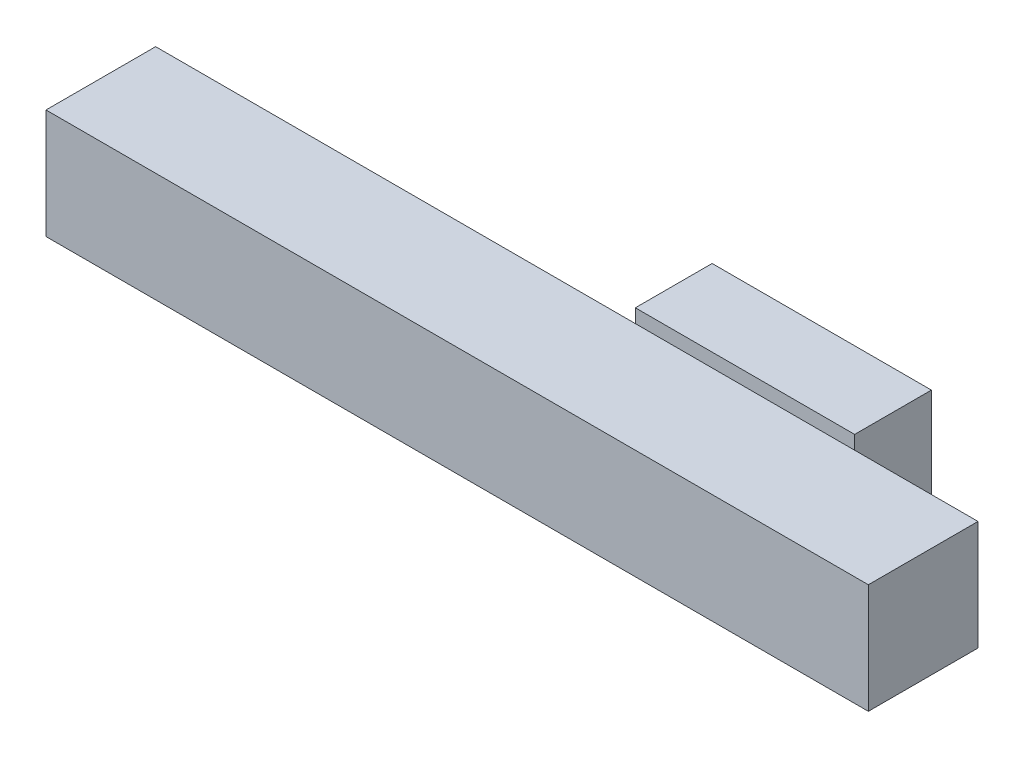
ISO-10303-21;
HEADER;
FILE_DESCRIPTION(('STEP AP214'),'2;1');
FILE_NAME('part.step','',(''),(''),'','','');
FILE_SCHEMA(('AUTOMOTIVE_DESIGN { 1 0 10303 214 1 1 1 1 }'));
ENDSEC;
DATA;
#1=APPLICATION_CONTEXT('core data for automotive mechanical design processes');
#2=APPLICATION_PROTOCOL_DEFINITION('international standard','automotive_design',2000,#1);
#3=PRODUCT_CONTEXT('',#1,'mechanical');
#4=PRODUCT('Part','Part','',(#3));
#5=PRODUCT_RELATED_PRODUCT_CATEGORY('part','',(#4));
#6=PRODUCT_DEFINITION_FORMATION('','',#4);
#7=PRODUCT_DEFINITION_CONTEXT('part definition',#1,'design');
#8=PRODUCT_DEFINITION('design','',#6,#7);
#9=PRODUCT_DEFINITION_SHAPE('','',#8);
#10=(LENGTH_UNIT() NAMED_UNIT(*) SI_UNIT(.MILLI.,.METRE.));
#11=(NAMED_UNIT(*) PLANE_ANGLE_UNIT() SI_UNIT($,.RADIAN.));
#12=(NAMED_UNIT(*) SI_UNIT($,.STERADIAN.) SOLID_ANGLE_UNIT());
#13=UNCERTAINTY_MEASURE_WITH_UNIT(LENGTH_MEASURE(1.E-05),#10,'distance_accuracy_value','');
#14=(GEOMETRIC_REPRESENTATION_CONTEXT(3) GLOBAL_UNCERTAINTY_ASSIGNED_CONTEXT((#13)) GLOBAL_UNIT_ASSIGNED_CONTEXT((#10,
#11,#12)) REPRESENTATION_CONTEXT('',''));
#15=CARTESIAN_POINT('',(0.,0.,0.));
#16=DIRECTION('',(0.,0.,1.));
#17=DIRECTION('',(1.,0.,0.));
#18=AXIS2_PLACEMENT_3D('',#15,#16,#17);
#19=CARTESIAN_POINT('',(0.,0.,28.));
#20=DIRECTION('',(0.,0.,-1.));
#21=DIRECTION('',(-1.,0.,0.));
#22=AXIS2_PLACEMENT_3D('',#19,#20,#21);
#23=PLANE('',#22);
#24=DIRECTION('',(1.,0.,0.));
#25=VECTOR('',#24,1.);
#26=CARTESIAN_POINT('',(-215.,-20.5,28.));
#27=LINE('',#26,#25);
#28=CARTESIAN_POINT('',(-40.,-20.5,28.));
#29=VERTEX_POINT('',#28);
#30=CARTESIAN_POINT('',(40.,-20.5,28.));
#31=VERTEX_POINT('',#30);
#32=EDGE_CURVE('E11',#29,#31,#27,.T.);
#33=ORIENTED_EDGE('',*,*,#32,.F.);
#34=DIRECTION('',(0.,-1.,0.));
#35=VECTOR('',#34,1.);
#36=CARTESIAN_POINT('',(-40.,-24.5,28.));
#37=LINE('',#36,#35);
#38=CARTESIAN_POINT('',(-40.,-24.5,28.));
#39=VERTEX_POINT('',#38);
#40=EDGE_CURVE('E156',#29,#39,#37,.T.);
#41=ORIENTED_EDGE('',*,*,#40,.T.);
#42=DIRECTION('',(1.,0.,0.));
#43=VECTOR('',#42,1.);
#44=CARTESIAN_POINT('',(-40.,-24.5,28.));
#45=LINE('',#44,#43);
#46=CARTESIAN_POINT('',(40.,-24.5,28.));
#47=VERTEX_POINT('',#46);
#48=EDGE_CURVE('E159',#39,#47,#45,.T.);
#49=ORIENTED_EDGE('',*,*,#48,.T.);
#50=DIRECTION('',(0.,1.,0.));
#51=VECTOR('',#50,1.);
#52=CARTESIAN_POINT('',(40.,-24.5,28.));
#53=LINE('',#52,#51);
#54=EDGE_CURVE('E150',#47,#31,#53,.T.);
#55=ORIENTED_EDGE('',*,*,#54,.T.);
#56=EDGE_LOOP('',(#33,#41,#49,#55));
#57=FACE_BOUND('',#56,.T.);
#58=ADVANCED_FACE('F37',(#57),#23,.F.);
#59=DIRECTION('',(-1.,0.,0.));
#60=VECTOR('',#59,1.);
#61=CARTESIAN_POINT('',(-215.,19.5,28.));
#62=LINE('',#61,#60);
#63=CARTESIAN_POINT('',(40.,19.5,28.));
#64=VERTEX_POINT('',#63);
#65=CARTESIAN_POINT('',(-40.,19.5,28.));
#66=VERTEX_POINT('',#65);
#67=EDGE_CURVE('E46',#64,#66,#62,.T.);
#68=ORIENTED_EDGE('',*,*,#67,.F.);
#69=CARTESIAN_POINT('',(40.,24.5,28.));
#70=VERTEX_POINT('',#69);
#71=EDGE_CURVE('E154',#64,#70,#53,.T.);
#72=ORIENTED_EDGE('',*,*,#71,.T.);
#73=DIRECTION('',(-1.,0.,0.));
#74=VECTOR('',#73,1.);
#75=CARTESIAN_POINT('',(-40.,24.5,28.));
#76=LINE('',#75,#74);
#77=CARTESIAN_POINT('',(-40.,24.5,28.));
#78=VERTEX_POINT('',#77);
#79=EDGE_CURVE('E152',#70,#78,#76,.T.);
#80=ORIENTED_EDGE('',*,*,#79,.T.);
#81=EDGE_CURVE('E157',#78,#66,#37,.T.);
#82=ORIENTED_EDGE('',*,*,#81,.T.);
#83=EDGE_LOOP('',(#68,#72,#80,#82));
#84=FACE_BOUND('',#83,.T.);
#85=ADVANCED_FACE('F220',(#84),#23,.F.);
#86=CARTESIAN_POINT('',(40.,-24.5,28.));
#87=DIRECTION('',(-1.,0.,0.));
#88=DIRECTION('',(0.,0.,1.));
#89=AXIS2_PLACEMENT_3D('',#86,#87,#88);
#90=PLANE('',#89);
#91=DIRECTION('',(0.,1.,0.));
#92=VECTOR('',#91,1.);
#93=CARTESIAN_POINT('',(40.,-24.5,0.));
#94=LINE('',#93,#92);
#95=CARTESIAN_POINT('',(40.,-24.5,0.));
#96=VERTEX_POINT('',#95);
#97=CARTESIAN_POINT('',(40.,24.5,0.));
#98=VERTEX_POINT('',#97);
#99=EDGE_CURVE('E141',#96,#98,#94,.T.);
#100=ORIENTED_EDGE('',*,*,#99,.T.);
#101=DIRECTION('',(0.,0.,-1.));
#102=VECTOR('',#101,1.);
#103=CARTESIAN_POINT('',(40.,24.5,28.));
#104=LINE('',#103,#102);
#105=EDGE_CURVE('E41',#70,#98,#104,.T.);
#106=ORIENTED_EDGE('',*,*,#105,.F.);
#107=ORIENTED_EDGE('',*,*,#71,.F.);
#108=EDGE_CURVE('E153',#31,#64,#53,.T.);
#109=ORIENTED_EDGE('',*,*,#108,.F.);
#110=ORIENTED_EDGE('',*,*,#54,.F.);
#111=DIRECTION('',(0.,0.,-1.));
#112=VECTOR('',#111,1.);
#113=CARTESIAN_POINT('',(40.,-24.5,28.));
#114=LINE('',#113,#112);
#115=EDGE_CURVE('E161',#47,#96,#114,.T.);
#116=ORIENTED_EDGE('',*,*,#115,.T.);
#117=EDGE_LOOP('',(#100,#106,#107,#109,#110,#116));
#118=FACE_BOUND('',#117,.T.);
#119=ADVANCED_FACE('F39',(#118),#90,.F.);
#120=CARTESIAN_POINT('',(-40.,24.5,28.));
#121=DIRECTION('',(0.,-1.,0.));
#122=DIRECTION('',(0.,0.,-1.));
#123=AXIS2_PLACEMENT_3D('',#120,#121,#122);
#124=PLANE('',#123);
#125=DIRECTION('',(-1.,0.,0.));
#126=VECTOR('',#125,1.);
#127=CARTESIAN_POINT('',(-40.,24.5,0.));
#128=LINE('',#127,#126);
#129=CARTESIAN_POINT('',(-40.,24.5,0.));
#130=VERTEX_POINT('',#129);
#131=EDGE_CURVE('E144',#98,#130,#128,.T.);
#132=ORIENTED_EDGE('',*,*,#131,.T.);
#133=DIRECTION('',(0.,0.,-1.));
#134=VECTOR('',#133,1.);
#135=CARTESIAN_POINT('',(-40.,24.5,28.));
#136=LINE('',#135,#134);
#137=EDGE_CURVE('E172',#78,#130,#136,.T.);
#138=ORIENTED_EDGE('',*,*,#137,.F.);
#139=ORIENTED_EDGE('',*,*,#79,.F.);
#140=ORIENTED_EDGE('',*,*,#105,.T.);
#141=EDGE_LOOP('',(#132,#138,#139,#140));
#142=FACE_BOUND('',#141,.T.);
#143=ADVANCED_FACE('F221',(#142),#124,.F.);
#144=CARTESIAN_POINT('',(-40.,-24.5,28.));
#145=DIRECTION('',(1.,0.,0.));
#146=DIRECTION('',(0.,0.,-1.));
#147=AXIS2_PLACEMENT_3D('',#144,#145,#146);
#148=PLANE('',#147);
#149=DIRECTION('',(0.,-1.,0.));
#150=VECTOR('',#149,1.);
#151=CARTESIAN_POINT('',(-40.,-24.5,0.));
#152=LINE('',#151,#150);
#153=CARTESIAN_POINT('',(-40.,-24.5,0.));
#154=VERTEX_POINT('',#153);
#155=EDGE_CURVE('E164',#130,#154,#152,.T.);
#156=ORIENTED_EDGE('',*,*,#155,.T.);
#157=DIRECTION('',(0.,0.,-1.));
#158=VECTOR('',#157,1.);
#159=CARTESIAN_POINT('',(-40.,-24.5,28.));
#160=LINE('',#159,#158);
#161=EDGE_CURVE('E170',#39,#154,#160,.T.);
#162=ORIENTED_EDGE('',*,*,#161,.F.);
#163=ORIENTED_EDGE('',*,*,#40,.F.);
#164=EDGE_CURVE('E160',#66,#29,#37,.T.);
#165=ORIENTED_EDGE('',*,*,#164,.F.);
#166=ORIENTED_EDGE('',*,*,#81,.F.);
#167=ORIENTED_EDGE('',*,*,#137,.T.);
#168=EDGE_LOOP('',(#156,#162,#163,#165,#166,#167));
#169=FACE_BOUND('',#168,.T.);
#170=ADVANCED_FACE('F210',(#169),#148,.F.);
#171=CARTESIAN_POINT('',(-40.,-24.5,28.));
#172=DIRECTION('',(0.,1.,0.));
#173=DIRECTION('',(0.,0.,1.));
#174=AXIS2_PLACEMENT_3D('',#171,#172,#173);
#175=PLANE('',#174);
#176=DIRECTION('',(1.,0.,0.));
#177=VECTOR('',#176,1.);
#178=CARTESIAN_POINT('',(-40.,-24.5,0.));
#179=LINE('',#178,#177);
#180=EDGE_CURVE('E166',#154,#96,#179,.T.);
#181=ORIENTED_EDGE('',*,*,#180,.T.);
#182=ORIENTED_EDGE('',*,*,#115,.F.);
#183=ORIENTED_EDGE('',*,*,#48,.F.);
#184=ORIENTED_EDGE('',*,*,#161,.T.);
#185=EDGE_LOOP('',(#181,#182,#183,#184));
#186=FACE_BOUND('',#185,.T.);
#187=ADVANCED_FACE('F213',(#186),#175,.F.);
#188=CARTESIAN_POINT('',(0.,0.,0.));
#189=DIRECTION('',(0.,0.,-1.));
#190=DIRECTION('',(-1.,0.,0.));
#191=AXIS2_PLACEMENT_3D('',#188,#189,#190);
#192=PLANE('',#191);
#193=ORIENTED_EDGE('',*,*,#99,.F.);
#194=ORIENTED_EDGE('',*,*,#180,.F.);
#195=ORIENTED_EDGE('',*,*,#155,.F.);
#196=ORIENTED_EDGE('',*,*,#131,.F.);
#197=EDGE_LOOP('',(#193,#194,#195,#196));
#198=FACE_BOUND('',#197,.T.);
#199=ADVANCED_FACE('F223',(#198),#192,.T.);
#200=CARTESIAN_POINT('',(0.,0.,28.));
#201=DIRECTION('',(0.,0.,-1.));
#202=DIRECTION('',(-1.,0.,0.));
#203=AXIS2_PLACEMENT_3D('',#200,#201,#202);
#204=PLANE('',#203);
#205=CARTESIAN_POINT('',(85.,-20.5,28.));
#206=VERTEX_POINT('',#205);
#207=EDGE_CURVE('E49',#31,#206,#27,.T.);
#208=ORIENTED_EDGE('',*,*,#207,.F.);
#209=ORIENTED_EDGE('',*,*,#108,.T.);
#210=CARTESIAN_POINT('',(85.,19.5,28.));
#211=VERTEX_POINT('',#210);
#212=EDGE_CURVE('E183',#211,#64,#62,.T.);
#213=ORIENTED_EDGE('',*,*,#212,.F.);
#214=DIRECTION('',(0.,1.,0.));
#215=VECTOR('',#214,1.);
#216=CARTESIAN_POINT('',(85.,-20.5,28.));
#217=LINE('',#216,#215);
#218=EDGE_CURVE('E140',#206,#211,#217,.T.);
#219=ORIENTED_EDGE('',*,*,#218,.F.);
#220=EDGE_LOOP('',(#208,#209,#213,#219));
#221=FACE_BOUND('',#220,.T.);
#222=ADVANCED_FACE('F219',(#221),#204,.T.);
#223=CARTESIAN_POINT('',(85.,-20.5,68.));
#224=DIRECTION('',(-1.,0.,0.));
#225=DIRECTION('',(0.,0.,1.));
#226=AXIS2_PLACEMENT_3D('',#223,#224,#225);
#227=PLANE('',#226);
#228=ORIENTED_EDGE('',*,*,#218,.T.);
#229=DIRECTION('',(0.,0.,-1.));
#230=VECTOR('',#229,1.);
#231=CARTESIAN_POINT('',(85.,19.5,68.));
#232=LINE('',#231,#230);
#233=CARTESIAN_POINT('',(85.,19.5,68.));
#234=VERTEX_POINT('',#233);
#235=EDGE_CURVE('E121',#234,#211,#232,.T.);
#236=ORIENTED_EDGE('',*,*,#235,.F.);
#237=DIRECTION('',(0.,1.,0.));
#238=VECTOR('',#237,1.);
#239=CARTESIAN_POINT('',(85.,-20.5,68.));
#240=LINE('',#239,#238);
#241=CARTESIAN_POINT('',(85.,-20.5,68.));
#242=VERTEX_POINT('',#241);
#243=EDGE_CURVE('E128',#242,#234,#240,.T.);
#244=ORIENTED_EDGE('',*,*,#243,.F.);
#245=DIRECTION('',(0.,0.,-1.));
#246=VECTOR('',#245,1.);
#247=CARTESIAN_POINT('',(85.,-20.5,68.));
#248=LINE('',#247,#246);
#249=EDGE_CURVE('E191',#242,#206,#248,.T.);
#250=ORIENTED_EDGE('',*,*,#249,.T.);
#251=EDGE_LOOP('',(#228,#236,#244,#250));
#252=FACE_BOUND('',#251,.T.);
#253=ADVANCED_FACE('F138',(#252),#227,.F.);
#254=CARTESIAN_POINT('',(-215.,19.5,68.));
#255=DIRECTION('',(0.,-1.,0.));
#256=DIRECTION('',(0.,0.,-1.));
#257=AXIS2_PLACEMENT_3D('',#254,#255,#256);
#258=PLANE('',#257);
#259=ORIENTED_EDGE('',*,*,#212,.T.);
#260=ORIENTED_EDGE('',*,*,#67,.T.);
#261=CARTESIAN_POINT('',(-215.,19.5,28.));
#262=VERTEX_POINT('',#261);
#263=EDGE_CURVE('E184',#66,#262,#62,.T.);
#264=ORIENTED_EDGE('',*,*,#263,.T.);
#265=DIRECTION('',(0.,0.,-1.));
#266=VECTOR('',#265,1.);
#267=CARTESIAN_POINT('',(-215.,19.5,68.));
#268=LINE('',#267,#266);
#269=CARTESIAN_POINT('',(-215.,19.5,68.));
#270=VERTEX_POINT('',#269);
#271=EDGE_CURVE('E124',#270,#262,#268,.T.);
#272=ORIENTED_EDGE('',*,*,#271,.F.);
#273=DIRECTION('',(-1.,0.,0.));
#274=VECTOR('',#273,1.);
#275=CARTESIAN_POINT('',(-215.,19.5,68.));
#276=LINE('',#275,#274);
#277=EDGE_CURVE('E116',#234,#270,#276,.T.);
#278=ORIENTED_EDGE('',*,*,#277,.F.);
#279=ORIENTED_EDGE('',*,*,#235,.T.);
#280=EDGE_LOOP('',(#259,#260,#264,#272,#278,#279));
#281=FACE_BOUND('',#280,.T.);
#282=ADVANCED_FACE('F119',(#281),#258,.F.);
#283=CARTESIAN_POINT('',(-215.,-20.5,68.));
#284=DIRECTION('',(1.,0.,0.));
#285=DIRECTION('',(0.,0.,-1.));
#286=AXIS2_PLACEMENT_3D('',#283,#284,#285);
#287=PLANE('',#286);
#288=DIRECTION('',(0.,-1.,0.));
#289=VECTOR('',#288,1.);
#290=CARTESIAN_POINT('',(-215.,-20.5,28.));
#291=LINE('',#290,#289);
#292=CARTESIAN_POINT('',(-215.,-20.5,28.));
#293=VERTEX_POINT('',#292);
#294=EDGE_CURVE('E187',#262,#293,#291,.T.);
#295=ORIENTED_EDGE('',*,*,#294,.T.);
#296=DIRECTION('',(0.,0.,-1.));
#297=VECTOR('',#296,1.);
#298=CARTESIAN_POINT('',(-215.,-20.5,68.));
#299=LINE('',#298,#297);
#300=CARTESIAN_POINT('',(-215.,-20.5,68.));
#301=VERTEX_POINT('',#300);
#302=EDGE_CURVE('E146',#301,#293,#299,.T.);
#303=ORIENTED_EDGE('',*,*,#302,.F.);
#304=DIRECTION('',(0.,-1.,0.));
#305=VECTOR('',#304,1.);
#306=CARTESIAN_POINT('',(-215.,-20.5,68.));
#307=LINE('',#306,#305);
#308=EDGE_CURVE('E127',#270,#301,#307,.T.);
#309=ORIENTED_EDGE('',*,*,#308,.F.);
#310=ORIENTED_EDGE('',*,*,#271,.T.);
#311=EDGE_LOOP('',(#295,#303,#309,#310));
#312=FACE_BOUND('',#311,.T.);
#313=ADVANCED_FACE('F195',(#312),#287,.F.);
#314=CARTESIAN_POINT('',(-215.,-20.5,68.));
#315=DIRECTION('',(0.,1.,0.));
#316=DIRECTION('',(0.,0.,1.));
#317=AXIS2_PLACEMENT_3D('',#314,#315,#316);
#318=PLANE('',#317);
#319=EDGE_CURVE('E48',#293,#29,#27,.T.);
#320=ORIENTED_EDGE('',*,*,#319,.T.);
#321=ORIENTED_EDGE('',*,*,#32,.T.);
#322=ORIENTED_EDGE('',*,*,#207,.T.);
#323=ORIENTED_EDGE('',*,*,#249,.F.);
#324=DIRECTION('',(1.,0.,0.));
#325=VECTOR('',#324,1.);
#326=CARTESIAN_POINT('',(-215.,-20.5,68.));
#327=LINE('',#326,#325);
#328=EDGE_CURVE('E133',#301,#242,#327,.T.);
#329=ORIENTED_EDGE('',*,*,#328,.F.);
#330=ORIENTED_EDGE('',*,*,#302,.T.);
#331=EDGE_LOOP('',(#320,#321,#322,#323,#329,#330));
#332=FACE_BOUND('',#331,.T.);
#333=ADVANCED_FACE('F200',(#332),#318,.F.);
#334=CARTESIAN_POINT('',(0.,0.,68.));
#335=DIRECTION('',(0.,0.,-1.));
#336=DIRECTION('',(-1.,0.,0.));
#337=AXIS2_PLACEMENT_3D('',#334,#335,#336);
#338=PLANE('',#337);
#339=ORIENTED_EDGE('',*,*,#243,.T.);
#340=ORIENTED_EDGE('',*,*,#277,.T.);
#341=ORIENTED_EDGE('',*,*,#308,.T.);
#342=ORIENTED_EDGE('',*,*,#328,.T.);
#343=EDGE_LOOP('',(#339,#340,#341,#342));
#344=FACE_BOUND('',#343,.T.);
#345=ADVANCED_FACE('F131',(#344),#338,.F.);
#346=ORIENTED_EDGE('',*,*,#263,.F.);
#347=ORIENTED_EDGE('',*,*,#164,.T.);
#348=ORIENTED_EDGE('',*,*,#319,.F.);
#349=ORIENTED_EDGE('',*,*,#294,.F.);
#350=EDGE_LOOP('',(#346,#347,#348,#349));
#351=FACE_BOUND('',#350,.T.);
#352=ADVANCED_FACE('F205',(#351),#204,.T.);
#353=CLOSED_SHELL('',(#58,#85,#119,#143,#170,#187,#199,#222,#253,#282,#313,#333,#345,#352));
#354=MANIFOLD_SOLID_BREP('B2',#353);
#355=ADVANCED_BREP_SHAPE_REPRESENTATION('',(#18,#354),#14);
#356=SHAPE_DEFINITION_REPRESENTATION(#9,#355);
ENDSEC;
END-ISO-10303-21;
